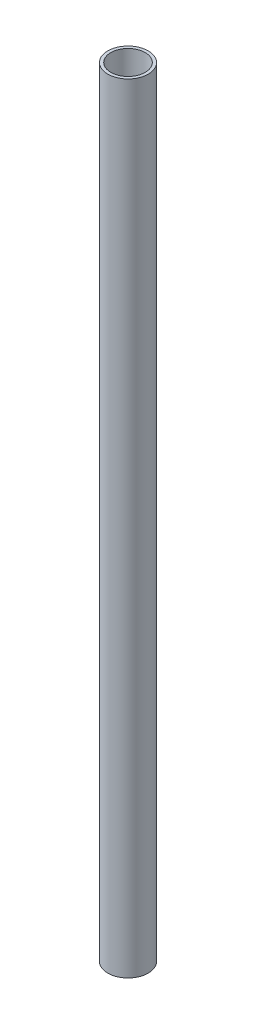
ISO-10303-21;
HEADER;
FILE_DESCRIPTION(('STEP AP214'),'2;1');
FILE_NAME('part.step','',(''),(''),'','','');
FILE_SCHEMA(('AUTOMOTIVE_DESIGN { 1 0 10303 214 1 1 1 1 }'));
ENDSEC;
DATA;
#1=APPLICATION_CONTEXT('core data for automotive mechanical design processes');
#2=APPLICATION_PROTOCOL_DEFINITION('international standard','automotive_design',2000,#1);
#3=PRODUCT_CONTEXT('',#1,'mechanical');
#4=PRODUCT('Part','Part','',(#3));
#5=PRODUCT_RELATED_PRODUCT_CATEGORY('part','',(#4));
#6=PRODUCT_DEFINITION_FORMATION('','',#4);
#7=PRODUCT_DEFINITION_CONTEXT('part definition',#1,'design');
#8=PRODUCT_DEFINITION('design','',#6,#7);
#9=PRODUCT_DEFINITION_SHAPE('','',#8);
#10=(LENGTH_UNIT() NAMED_UNIT(*) SI_UNIT(.MILLI.,.METRE.));
#11=(NAMED_UNIT(*) PLANE_ANGLE_UNIT() SI_UNIT($,.RADIAN.));
#12=(NAMED_UNIT(*) SI_UNIT($,.STERADIAN.) SOLID_ANGLE_UNIT());
#13=UNCERTAINTY_MEASURE_WITH_UNIT(LENGTH_MEASURE(1.E-05),#10,'distance_accuracy_value','');
#14=(GEOMETRIC_REPRESENTATION_CONTEXT(3) GLOBAL_UNCERTAINTY_ASSIGNED_CONTEXT((#13)) GLOBAL_UNIT_ASSIGNED_CONTEXT((#10,
#11,#12)) REPRESENTATION_CONTEXT('',''));
#15=CARTESIAN_POINT('',(0.,0.,0.));
#16=DIRECTION('',(0.,0.,1.));
#17=DIRECTION('',(1.,0.,0.));
#18=AXIS2_PLACEMENT_3D('',#15,#16,#17);
#19=CARTESIAN_POINT('',(0.,-69.1906615290178,0.));
#20=DIRECTION('',(0.,-1.,0.));
#21=DIRECTION('',(1.,0.,0.));
#22=AXIS2_PLACEMENT_3D('',#19,#20,#21);
#23=CYLINDRICAL_SURFACE('',#22,11.1125);
#24=CARTESIAN_POINT('',(0.,214.249,0.));
#25=DIRECTION('',(0.,-1.,0.));
#26=DIRECTION('',(1.,0.,0.));
#27=AXIS2_PLACEMENT_3D('',#24,#25,#26);
#28=CIRCLE('',#27,11.1125);
#29=CARTESIAN_POINT('',(11.1124999999999,214.249,0.));
#30=VERTEX_POINT('',#29);
#31=EDGE_CURVE('E49',#30,#30,#28,.T.);
#32=ORIENTED_EDGE('',*,*,#31,.T.);
#33=EDGE_LOOP('',(#32));
#34=FACE_BOUND('',#33,.T.);
#35=CARTESIAN_POINT('',(0.,-214.249,0.));
#36=DIRECTION('',(0.,-1.,0.));
#37=DIRECTION('',(1.,0.,0.));
#38=AXIS2_PLACEMENT_3D('',#35,#36,#37);
#39=CIRCLE('',#38,11.1125);
#40=CARTESIAN_POINT('',(11.1125,-214.249,0.));
#41=VERTEX_POINT('',#40);
#42=EDGE_CURVE('E10',#41,#41,#39,.T.);
#43=ORIENTED_EDGE('',*,*,#42,.F.);
#44=EDGE_LOOP('',(#43));
#45=FACE_BOUND('',#44,.T.);
#46=ADVANCED_FACE('F35',(#34,#45),#23,.T.);
#47=CARTESIAN_POINT('',(9.46150000000002,-214.249,0.));
#48=DIRECTION('',(0.,-1.,0.));
#49=DIRECTION('',(1.,0.,0.));
#50=AXIS2_PLACEMENT_3D('',#47,#48,#49);
#51=PLANE('',#50);
#52=ORIENTED_EDGE('',*,*,#42,.T.);
#53=EDGE_LOOP('',(#52));
#54=FACE_BOUND('',#53,.T.);
#55=CARTESIAN_POINT('',(0.,-214.249,0.));
#56=DIRECTION('',(0.,-1.,0.));
#57=DIRECTION('',(1.,0.,0.));
#58=AXIS2_PLACEMENT_3D('',#55,#56,#57);
#59=CIRCLE('',#58,9.4615);
#60=CARTESIAN_POINT('',(9.46150000000002,-214.249,0.));
#61=VERTEX_POINT('',#60);
#62=EDGE_CURVE('E41',#61,#61,#59,.T.);
#63=ORIENTED_EDGE('',*,*,#62,.F.);
#64=EDGE_LOOP('',(#63));
#65=FACE_BOUND('',#64,.T.);
#66=ADVANCED_FACE('F65',(#54,#65),#51,.T.);
#67=CARTESIAN_POINT('',(0.,-69.1906615290178,0.));
#68=DIRECTION('',(0.,-1.,0.));
#69=DIRECTION('',(1.,0.,0.));
#70=AXIS2_PLACEMENT_3D('',#67,#68,#69);
#71=CYLINDRICAL_SURFACE('',#70,9.46149999999999);
#72=ORIENTED_EDGE('',*,*,#62,.T.);
#73=EDGE_LOOP('',(#72));
#74=FACE_BOUND('',#73,.T.);
#75=CARTESIAN_POINT('',(0.,214.249,0.));
#76=DIRECTION('',(0.,-1.,0.));
#77=DIRECTION('',(1.,0.,0.));
#78=AXIS2_PLACEMENT_3D('',#75,#76,#77);
#79=CIRCLE('',#78,9.46149999999999);
#80=CARTESIAN_POINT('',(9.46149999999994,214.249,0.));
#81=VERTEX_POINT('',#80);
#82=EDGE_CURVE('E45',#81,#81,#79,.T.);
#83=ORIENTED_EDGE('',*,*,#82,.F.);
#84=EDGE_LOOP('',(#83));
#85=FACE_BOUND('',#84,.T.);
#86=ADVANCED_FACE('F59',(#74,#85),#71,.F.);
#87=CARTESIAN_POINT('',(9.46149999999994,214.249,0.));
#88=DIRECTION('',(0.,1.,0.));
#89=DIRECTION('',(-1.,0.,0.));
#90=AXIS2_PLACEMENT_3D('',#87,#88,#89);
#91=PLANE('',#90);
#92=ORIENTED_EDGE('',*,*,#82,.T.);
#93=EDGE_LOOP('',(#92));
#94=FACE_BOUND('',#93,.T.);
#95=ORIENTED_EDGE('',*,*,#31,.F.);
#96=EDGE_LOOP('',(#95));
#97=FACE_BOUND('',#96,.T.);
#98=ADVANCED_FACE('F57',(#94,#97),#91,.T.);
#99=CLOSED_SHELL('',(#46,#66,#86,#98));
#100=MANIFOLD_SOLID_BREP('B2',#99);
#101=ADVANCED_BREP_SHAPE_REPRESENTATION('',(#18,#100),#14);
#102=SHAPE_DEFINITION_REPRESENTATION(#9,#101);
ENDSEC;
END-ISO-10303-21;
